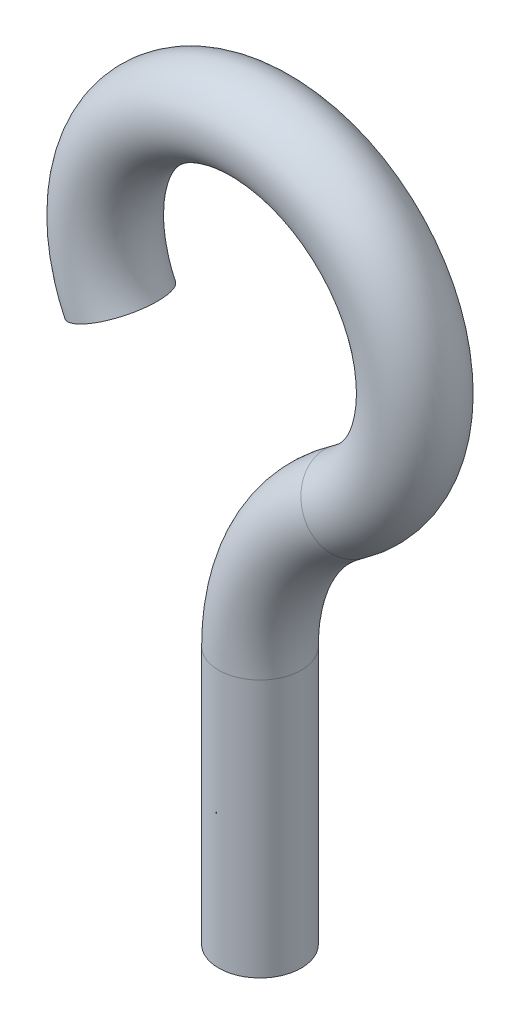
ISO-10303-21;
HEADER;
FILE_DESCRIPTION(('STEP AP214'),'2;1');
FILE_NAME('part.step','',(''),(''),'','','');
FILE_SCHEMA(('AUTOMOTIVE_DESIGN { 1 0 10303 214 1 1 1 1 }'));
ENDSEC;
DATA;
#1=APPLICATION_CONTEXT('core data for automotive mechanical design processes');
#2=APPLICATION_PROTOCOL_DEFINITION('international standard','automotive_design',2000,#1);
#3=PRODUCT_CONTEXT('',#1,'mechanical');
#4=PRODUCT('Part','Part','',(#3));
#5=PRODUCT_RELATED_PRODUCT_CATEGORY('part','',(#4));
#6=PRODUCT_DEFINITION_FORMATION('','',#4);
#7=PRODUCT_DEFINITION_CONTEXT('part definition',#1,'design');
#8=PRODUCT_DEFINITION('design','',#6,#7);
#9=PRODUCT_DEFINITION_SHAPE('','',#8);
#10=(LENGTH_UNIT() NAMED_UNIT(*) SI_UNIT(.MILLI.,.METRE.));
#11=(NAMED_UNIT(*) PLANE_ANGLE_UNIT() SI_UNIT($,.RADIAN.));
#12=(NAMED_UNIT(*) SI_UNIT($,.STERADIAN.) SOLID_ANGLE_UNIT());
#13=UNCERTAINTY_MEASURE_WITH_UNIT(LENGTH_MEASURE(1.E-05),#10,'distance_accuracy_value','');
#14=(GEOMETRIC_REPRESENTATION_CONTEXT(3) GLOBAL_UNCERTAINTY_ASSIGNED_CONTEXT((#13)) GLOBAL_UNIT_ASSIGNED_CONTEXT((#10,
#11,#12)) REPRESENTATION_CONTEXT('',''));
#15=CARTESIAN_POINT('',(0.,0.,0.));
#16=DIRECTION('',(0.,0.,1.));
#17=DIRECTION('',(1.,0.,0.));
#18=AXIS2_PLACEMENT_3D('',#15,#16,#17);
#19=CARTESIAN_POINT('',(0.,0.,0.));
#20=DIRECTION('',(0.,1.,0.));
#21=DIRECTION('',(0.,0.,1.));
#22=AXIS2_PLACEMENT_3D('',#19,#20,#21);
#23=CYLINDRICAL_SURFACE('',#22,4.);
#24=CARTESIAN_POINT('',(0.,25.,0.));
#25=DIRECTION('',(0.,1.,0.));
#26=DIRECTION('',(0.,0.,1.));
#27=AXIS2_PLACEMENT_3D('',#24,#25,#26);
#28=CIRCLE('',#27,4.);
#29=CARTESIAN_POINT('',(-4.,25.,0.));
#30=VERTEX_POINT('',#29);
#31=EDGE_CURVE('E70',#30,#30,#28,.T.);
#32=ORIENTED_EDGE('',*,*,#31,.F.);
#33=EDGE_LOOP('',(#32));
#34=FACE_BOUND('',#33,.T.);
#35=CARTESIAN_POINT('',(0.,0.,0.));
#36=DIRECTION('',(0.,1.,0.));
#37=DIRECTION('',(0.,0.,1.));
#38=AXIS2_PLACEMENT_3D('',#35,#36,#37);
#39=CIRCLE('',#38,4.);
#40=CARTESIAN_POINT('',(0.,0.,4.));
#41=VERTEX_POINT('',#40);
#42=EDGE_CURVE('E67',#41,#41,#39,.T.);
#43=ORIENTED_EDGE('',*,*,#42,.T.);
#44=EDGE_LOOP('',(#43));
#45=FACE_BOUND('',#44,.T.);
#46=ADVANCED_FACE('F43',(#34,#45),#23,.T.);
#47=CARTESIAN_POINT('',(20.,25.,0.));
#48=DIRECTION('',(0.,0.,-1.));
#49=DIRECTION('',(-1.,0.,0.));
#50=AXIS2_PLACEMENT_3D('',#47,#48,#49);
#51=TOROIDAL_SURFACE('',#50,20.,4.);
#52=CARTESIAN_POINT('',(8.57142857142858,41.4130361329658,0.));
#53=DIRECTION('',(0.82065180664829,0.571428571428571,0.));
#54=DIRECTION('',(0.,0.,1.));
#55=AXIS2_PLACEMENT_3D('',#52,#53,#54);
#56=CIRCLE('',#55,4.);
#57=CARTESIAN_POINT('',(6.28571428571429,44.695643359559,0.));
#58=VERTEX_POINT('',#57);
#59=EDGE_CURVE('E47',#58,#58,#56,.T.);
#60=CARTESIAN_POINT('',(20.,25.,0.));
#61=DIRECTION('',(0.,0.,-1.));
#62=DIRECTION('',(-1.,0.,0.));
#63=AXIS2_PLACEMENT_3D('',#60,#61,#62);
#64=CIRCLE('',#63,24.);
#65=EDGE_CURVE('',#30,#58,#64,.T.);
#66=ORIENTED_EDGE('',*,*,#31,.T.);
#67=ORIENTED_EDGE('',*,*,#59,.F.);
#68=ORIENTED_EDGE('',*,*,#65,.T.);
#69=ORIENTED_EDGE('',*,*,#65,.F.);
#70=EDGE_LOOP('',(#66,#68,#67,#69));
#71=FACE_BOUND('',#70,.T.);
#72=ADVANCED_FACE('F80',(#71),#51,.T.);
#73=CARTESIAN_POINT('',(0.,53.7228132326902,0.));
#74=DIRECTION('',(0.,0.,1.));
#75=DIRECTION('',(1.,0.,0.));
#76=AXIS2_PLACEMENT_3D('',#73,#74,#75);
#77=TOROIDAL_SURFACE('',#76,15.,4.);
#78=CARTESIAN_POINT('',(-13.5416728387125,47.2712167845794,0.));
#79=DIRECTION('',(0.430106429874048,-0.902778189247503,0.));
#80=DIRECTION('',(0.,0.,1.));
#81=AXIS2_PLACEMENT_3D('',#78,#79,#80);
#82=CIRCLE('',#81,4.);
#83=CARTESIAN_POINT('',(-13.5416728387125,47.2712167845794,4.));
#84=VERTEX_POINT('',#83);
#85=EDGE_CURVE('E62',#84,#84,#82,.T.);
#86=ORIENTED_EDGE('',*,*,#85,.F.);
#87=EDGE_LOOP('',(#86));
#88=FACE_BOUND('',#87,.T.);
#89=ORIENTED_EDGE('',*,*,#59,.T.);
#90=EDGE_LOOP('',(#89));
#91=FACE_BOUND('',#90,.T.);
#92=ADVANCED_FACE('F45',(#88,#91),#77,.T.);
#93=CARTESIAN_POINT('',(0.,0.,0.));
#94=DIRECTION('',(0.,1.,0.));
#95=DIRECTION('',(0.,0.,1.));
#96=AXIS2_PLACEMENT_3D('',#93,#94,#95);
#97=PLANE('',#96);
#98=CARTESIAN_POINT('',(0.,0.,0.));
#99=DIRECTION('',(0.,1.,0.));
#100=DIRECTION('',(0.,0.,1.));
#101=AXIS2_PLACEMENT_3D('',#98,#99,#100);
#102=CIRCLE('',#101,3.);
#103=CARTESIAN_POINT('',(0.,0.,3.));
#104=VERTEX_POINT('',#103);
#105=EDGE_CURVE('E66',#104,#104,#102,.F.);
#106=ORIENTED_EDGE('',*,*,#105,.F.);
#107=EDGE_LOOP('',(#106));
#108=FACE_BOUND('',#107,.T.);
#109=ORIENTED_EDGE('',*,*,#42,.F.);
#110=EDGE_LOOP('',(#109));
#111=FACE_BOUND('',#110,.T.);
#112=ADVANCED_FACE('F86',(#108,#111),#97,.F.);
#113=CARTESIAN_POINT('',(-13.5416728387125,47.2712167845794,0.));
#114=DIRECTION('',(0.430106429874048,-0.902778189247503,0.));
#115=DIRECTION('',(0.,0.,1.));
#116=AXIS2_PLACEMENT_3D('',#113,#114,#115);
#117=PLANE('',#116);
#118=CARTESIAN_POINT('',(-13.5416728387125,47.2712167845794,0.));
#119=DIRECTION('',(0.430106429874048,-0.902778189247503,0.));
#120=DIRECTION('',(0.,0.,1.));
#121=AXIS2_PLACEMENT_3D('',#118,#119,#120);
#122=CIRCLE('',#121,3.);
#123=CARTESIAN_POINT('',(-13.5416728387125,47.2712167845794,3.));
#124=VERTEX_POINT('',#123);
#125=EDGE_CURVE('E10',#124,#124,#122,.F.);
#126=ORIENTED_EDGE('',*,*,#125,.T.);
#127=EDGE_LOOP('',(#126));
#128=FACE_BOUND('',#127,.T.);
#129=ORIENTED_EDGE('',*,*,#85,.T.);
#130=EDGE_LOOP('',(#129));
#131=FACE_BOUND('',#130,.T.);
#132=ADVANCED_FACE('F104',(#128,#131),#117,.T.);
#133=CARTESIAN_POINT('',(0.,0.,0.));
#134=DIRECTION('',(0.,1.,0.));
#135=DIRECTION('',(0.,0.,1.));
#136=AXIS2_PLACEMENT_3D('',#133,#134,#135);
#137=CYLINDRICAL_SURFACE('',#136,3.);
#138=CARTESIAN_POINT('',(0.,25.,0.));
#139=DIRECTION('',(0.,1.,0.));
#140=DIRECTION('',(0.,0.,1.));
#141=AXIS2_PLACEMENT_3D('',#138,#139,#140);
#142=CIRCLE('',#141,3.);
#143=CARTESIAN_POINT('',(-3.,25.,0.));
#144=VERTEX_POINT('',#143);
#145=EDGE_CURVE('E58',#144,#144,#142,.F.);
#146=ORIENTED_EDGE('',*,*,#145,.F.);
#147=EDGE_LOOP('',(#146));
#148=FACE_BOUND('',#147,.T.);
#149=ORIENTED_EDGE('',*,*,#105,.T.);
#150=EDGE_LOOP('',(#149));
#151=FACE_BOUND('',#150,.T.);
#152=ADVANCED_FACE('F98',(#148,#151),#137,.F.);
#153=CARTESIAN_POINT('',(20.,25.,0.));
#154=DIRECTION('',(0.,0.,-1.));
#155=DIRECTION('',(-1.,0.,0.));
#156=AXIS2_PLACEMENT_3D('',#153,#154,#155);
#157=TOROIDAL_SURFACE('',#156,20.,3.);
#158=CARTESIAN_POINT('',(8.57142857142858,41.4130361329658,0.));
#159=DIRECTION('',(0.82065180664829,0.571428571428571,0.));
#160=DIRECTION('',(0.,0.,1.));
#161=AXIS2_PLACEMENT_3D('',#158,#159,#160);
#162=CIRCLE('',#161,3.);
#163=CARTESIAN_POINT('',(6.85714285714286,43.8749915529107,0.));
#164=VERTEX_POINT('',#163);
#165=EDGE_CURVE('E52',#164,#164,#162,.F.);
#166=CARTESIAN_POINT('',(20.,25.,0.));
#167=DIRECTION('',(0.,0.,-1.));
#168=DIRECTION('',(-1.,0.,0.));
#169=AXIS2_PLACEMENT_3D('',#166,#167,#168);
#170=CIRCLE('',#169,23.);
#171=EDGE_CURVE('',#144,#164,#170,.T.);
#172=ORIENTED_EDGE('',*,*,#145,.T.);
#173=ORIENTED_EDGE('',*,*,#165,.F.);
#174=ORIENTED_EDGE('',*,*,#171,.T.);
#175=ORIENTED_EDGE('',*,*,#171,.F.);
#176=EDGE_LOOP('',(#172,#174,#173,#175));
#177=FACE_BOUND('',#176,.T.);
#178=ADVANCED_FACE('F92',(#177),#157,.F.);
#179=CARTESIAN_POINT('',(0.,53.7228132326902,0.));
#180=DIRECTION('',(0.,0.,1.));
#181=DIRECTION('',(1.,0.,0.));
#182=AXIS2_PLACEMENT_3D('',#179,#180,#181);
#183=TOROIDAL_SURFACE('',#182,15.,3.);
#184=ORIENTED_EDGE('',*,*,#125,.F.);
#185=EDGE_LOOP('',(#184));
#186=FACE_BOUND('',#185,.T.);
#187=ORIENTED_EDGE('',*,*,#165,.T.);
#188=EDGE_LOOP('',(#187));
#189=FACE_BOUND('',#188,.T.);
#190=ADVANCED_FACE('F90',(#186,#189),#183,.F.);
#191=CLOSED_SHELL('',(#46,#72,#92,#112,#132,#152,#178,#190));
#192=MANIFOLD_SOLID_BREP('B2',#191);
#193=ADVANCED_BREP_SHAPE_REPRESENTATION('',(#18,#192),#14);
#194=SHAPE_DEFINITION_REPRESENTATION(#9,#193);
ENDSEC;
END-ISO-10303-21;
